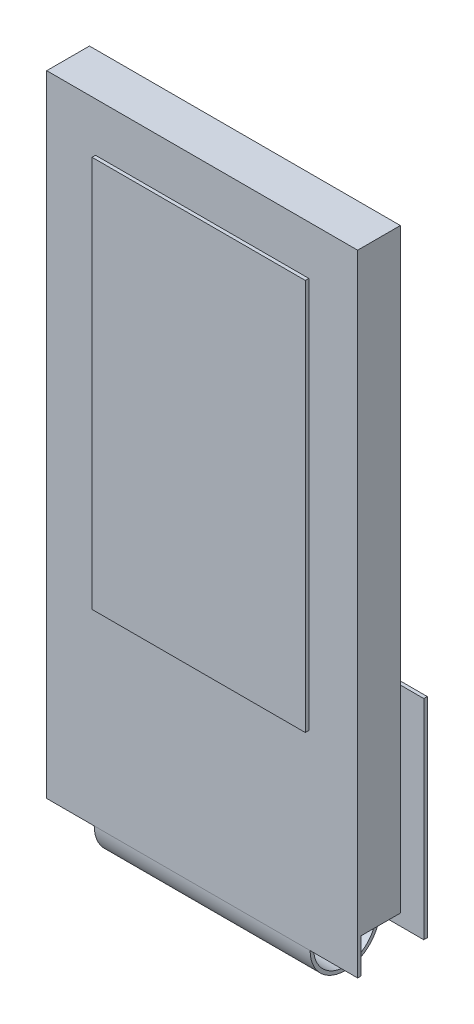
ISO-10303-21;
HEADER;
FILE_DESCRIPTION(('STEP AP214'),'2;1');
FILE_NAME('part.step','',(''),(''),'','','');
FILE_SCHEMA(('AUTOMOTIVE_DESIGN { 1 0 10303 214 1 1 1 1 }'));
ENDSEC;
DATA;
#1=APPLICATION_CONTEXT('core data for automotive mechanical design processes');
#2=APPLICATION_PROTOCOL_DEFINITION('international standard','automotive_design',2000,#1);
#3=PRODUCT_CONTEXT('',#1,'mechanical');
#4=PRODUCT('Part','Part','',(#3));
#5=PRODUCT_RELATED_PRODUCT_CATEGORY('part','',(#4));
#6=PRODUCT_DEFINITION_FORMATION('','',#4);
#7=PRODUCT_DEFINITION_CONTEXT('part definition',#1,'design');
#8=PRODUCT_DEFINITION('design','',#6,#7);
#9=PRODUCT_DEFINITION_SHAPE('','',#8);
#10=(LENGTH_UNIT() NAMED_UNIT(*) SI_UNIT(.MILLI.,.METRE.));
#11=(NAMED_UNIT(*) PLANE_ANGLE_UNIT() SI_UNIT($,.RADIAN.));
#12=(NAMED_UNIT(*) SI_UNIT($,.STERADIAN.) SOLID_ANGLE_UNIT());
#13=UNCERTAINTY_MEASURE_WITH_UNIT(LENGTH_MEASURE(1.E-05),#10,'distance_accuracy_value','');
#14=(GEOMETRIC_REPRESENTATION_CONTEXT(3) GLOBAL_UNCERTAINTY_ASSIGNED_CONTEXT((#13)) GLOBAL_UNIT_ASSIGNED_CONTEXT((#10,
#11,#12)) REPRESENTATION_CONTEXT('',''));
#15=CARTESIAN_POINT('',(0.,0.,0.));
#16=DIRECTION('',(0.,0.,1.));
#17=DIRECTION('',(1.,0.,0.));
#18=AXIS2_PLACEMENT_3D('',#15,#16,#17);
#19=CARTESIAN_POINT('',(4.464,-8.55,1.227));
#20=DIRECTION('',(-1.,0.,0.));
#21=DIRECTION('',(0.,0.,1.));
#22=AXIS2_PLACEMENT_3D('',#19,#20,#21);
#23=PLANE('',#22);
#24=DIRECTION('',(0.,1.,0.));
#25=VECTOR('',#24,1.);
#26=CARTESIAN_POINT('',(4.464,-8.55,1.227));
#27=LINE('',#26,#25);
#28=CARTESIAN_POINT('',(4.464,-9.55,1.227));
#29=VERTEX_POINT('',#28);
#30=CARTESIAN_POINT('',(4.464,8.55,1.227));
#31=VERTEX_POINT('',#30);
#32=EDGE_CURVE('E199',#29,#31,#27,.T.);
#33=ORIENTED_EDGE('',*,*,#32,.F.);
#34=DIRECTION('',(0.,0.,1.));
#35=VECTOR('',#34,1.);
#36=CARTESIAN_POINT('',(4.464,-9.55,-0.774));
#37=LINE('',#36,#35);
#38=CARTESIAN_POINT('',(4.464,-9.55,1.127));
#39=VERTEX_POINT('',#38);
#40=EDGE_CURVE('E416',#39,#29,#37,.T.);
#41=ORIENTED_EDGE('',*,*,#40,.F.);
#42=DIRECTION('',(0.,1.,0.));
#43=VECTOR('',#42,1.);
#44=CARTESIAN_POINT('',(4.464,-9.55,1.127));
#45=LINE('',#44,#43);
#46=CARTESIAN_POINT('',(4.464,-8.55,1.127));
#47=VERTEX_POINT('',#46);
#48=EDGE_CURVE('E250',#39,#47,#45,.T.);
#49=ORIENTED_EDGE('',*,*,#48,.T.);
#50=DIRECTION('',(0.,0.,-1.));
#51=VECTOR('',#50,1.);
#52=CARTESIAN_POINT('',(4.464,-8.55,1.227));
#53=LINE('',#52,#51);
#54=CARTESIAN_POINT('',(4.464,-8.55,0.));
#55=VERTEX_POINT('',#54);
#56=EDGE_CURVE('E63',#47,#55,#53,.T.);
#57=ORIENTED_EDGE('',*,*,#56,.T.);
#58=DIRECTION('',(0.,1.,0.));
#59=VECTOR('',#58,1.);
#60=CARTESIAN_POINT('',(4.464,-8.55,0.));
#61=LINE('',#60,#59);
#62=CARTESIAN_POINT('',(4.464,8.55,0.));
#63=VERTEX_POINT('',#62);
#64=EDGE_CURVE('E203',#55,#63,#61,.T.);
#65=ORIENTED_EDGE('',*,*,#64,.T.);
#66=DIRECTION('',(0.,0.,-1.));
#67=VECTOR('',#66,1.);
#68=CARTESIAN_POINT('',(4.464,8.55,1.227));
#69=LINE('',#68,#67);
#70=EDGE_CURVE('E11',#31,#63,#69,.T.);
#71=ORIENTED_EDGE('',*,*,#70,.F.);
#72=EDGE_LOOP('',(#33,#41,#49,#57,#65,#71));
#73=FACE_BOUND('',#72,.T.);
#74=ADVANCED_FACE('F40',(#73),#23,.F.);
#75=CARTESIAN_POINT('',(-4.464,-8.55,1.227));
#76=DIRECTION('',(1.,0.,0.));
#77=DIRECTION('',(0.,0.,-1.));
#78=AXIS2_PLACEMENT_3D('',#75,#76,#77);
#79=PLANE('',#78);
#80=DIRECTION('',(0.,-1.,0.));
#81=VECTOR('',#80,1.);
#82=CARTESIAN_POINT('',(-4.464,-9.55,1.127));
#83=LINE('',#82,#81);
#84=CARTESIAN_POINT('',(-4.464,-8.55,1.127));
#85=VERTEX_POINT('',#84);
#86=CARTESIAN_POINT('',(-4.464,-9.55,1.127));
#87=VERTEX_POINT('',#86);
#88=EDGE_CURVE('E186',#85,#87,#83,.T.);
#89=ORIENTED_EDGE('',*,*,#88,.T.);
#90=DIRECTION('',(0.,0.,1.));
#91=VECTOR('',#90,1.);
#92=CARTESIAN_POINT('',(-4.464,-9.55,-0.774));
#93=LINE('',#92,#91);
#94=CARTESIAN_POINT('',(-4.464,-9.55,1.227));
#95=VERTEX_POINT('',#94);
#96=EDGE_CURVE('E169',#87,#95,#93,.T.);
#97=ORIENTED_EDGE('',*,*,#96,.T.);
#98=DIRECTION('',(0.,-1.,0.));
#99=VECTOR('',#98,1.);
#100=CARTESIAN_POINT('',(-4.464,-8.55,1.227));
#101=LINE('',#100,#99);
#102=CARTESIAN_POINT('',(-4.464,8.55,1.227));
#103=VERTEX_POINT('',#102);
#104=EDGE_CURVE('E184',#103,#95,#101,.T.);
#105=ORIENTED_EDGE('',*,*,#104,.F.);
#106=DIRECTION('',(0.,0.,-1.));
#107=VECTOR('',#106,1.);
#108=CARTESIAN_POINT('',(-4.464,8.55,1.227));
#109=LINE('',#108,#107);
#110=CARTESIAN_POINT('',(-4.464,8.55,0.));
#111=VERTEX_POINT('',#110);
#112=EDGE_CURVE('E48',#103,#111,#109,.T.);
#113=ORIENTED_EDGE('',*,*,#112,.T.);
#114=DIRECTION('',(0.,-1.,0.));
#115=VECTOR('',#114,1.);
#116=CARTESIAN_POINT('',(-4.464,-8.55,0.));
#117=LINE('',#116,#115);
#118=CARTESIAN_POINT('',(-4.464,-8.55,0.));
#119=VERTEX_POINT('',#118);
#120=EDGE_CURVE('E209',#111,#119,#117,.T.);
#121=ORIENTED_EDGE('',*,*,#120,.T.);
#122=DIRECTION('',(0.,0.,-1.));
#123=VECTOR('',#122,1.);
#124=CARTESIAN_POINT('',(-4.464,-8.55,1.227));
#125=LINE('',#124,#123);
#126=EDGE_CURVE('E197',#85,#119,#125,.T.);
#127=ORIENTED_EDGE('',*,*,#126,.F.);
#128=EDGE_LOOP('',(#89,#97,#105,#113,#121,#127));
#129=FACE_BOUND('',#128,.T.);
#130=ADVANCED_FACE('F182',(#129),#79,.F.);
#131=CARTESIAN_POINT('',(0.,0.,1.227));
#132=DIRECTION('',(0.,0.,-1.));
#133=DIRECTION('',(-1.,0.,0.));
#134=AXIS2_PLACEMENT_3D('',#131,#132,#133);
#135=PLANE('',#134);
#136=ORIENTED_EDGE('',*,*,#32,.T.);
#137=DIRECTION('',(-1.,0.,0.));
#138=VECTOR('',#137,1.);
#139=CARTESIAN_POINT('',(-4.464,8.55,1.227));
#140=LINE('',#139,#138);
#141=EDGE_CURVE('E194',#31,#103,#140,.T.);
#142=ORIENTED_EDGE('',*,*,#141,.T.);
#143=ORIENTED_EDGE('',*,*,#104,.T.);
#144=DIRECTION('',(1.,0.,0.));
#145=VECTOR('',#144,1.);
#146=CARTESIAN_POINT('',(-11.7441098892805,-9.55,1.227));
#147=LINE('',#146,#145);
#148=CARTESIAN_POINT('',(-3.1,-9.55,1.227));
#149=VERTEX_POINT('',#148);
#150=EDGE_CURVE('E166',#95,#149,#147,.T.);
#151=ORIENTED_EDGE('',*,*,#150,.T.);
#152=CARTESIAN_POINT('',(3.1,-9.55,1.227));
#153=VERTEX_POINT('',#152);
#154=EDGE_CURVE('E178',#149,#153,#147,.T.);
#155=ORIENTED_EDGE('',*,*,#154,.T.);
#156=DIRECTION('',(-1.,0.,0.));
#157=VECTOR('',#156,1.);
#158=CARTESIAN_POINT('',(3.1,-9.55,1.227));
#159=LINE('',#158,#157);
#160=EDGE_CURVE('E296',#29,#153,#159,.T.);
#161=ORIENTED_EDGE('',*,*,#160,.F.);
#162=EDGE_LOOP('',(#136,#142,#143,#151,#155,#161));
#163=FACE_BOUND('',#162,.T.);
#164=DIRECTION('',(0.,1.,0.));
#165=VECTOR('',#164,1.);
#166=CARTESIAN_POINT('',(3.062,-4.097,1.227));
#167=LINE('',#166,#165);
#168=CARTESIAN_POINT('',(3.062,-4.097,1.227));
#169=VERTEX_POINT('',#168);
#170=CARTESIAN_POINT('',(3.062,7.147,1.227));
#171=VERTEX_POINT('',#170);
#172=EDGE_CURVE('E230',#169,#171,#167,.T.);
#173=ORIENTED_EDGE('',*,*,#172,.F.);
#174=DIRECTION('',(1.,0.,0.));
#175=VECTOR('',#174,1.);
#176=CARTESIAN_POINT('',(-3.062,-4.097,1.227));
#177=LINE('',#176,#175);
#178=CARTESIAN_POINT('',(-3.062,-4.097,1.227));
#179=VERTEX_POINT('',#178);
#180=EDGE_CURVE('E269',#179,#169,#177,.T.);
#181=ORIENTED_EDGE('',*,*,#180,.F.);
#182=DIRECTION('',(0.,-1.,0.));
#183=VECTOR('',#182,1.);
#184=CARTESIAN_POINT('',(-3.062,-4.097,1.227));
#185=LINE('',#184,#183);
#186=CARTESIAN_POINT('',(-3.062,7.147,1.227));
#187=VERTEX_POINT('',#186);
#188=EDGE_CURVE('E278',#187,#179,#185,.T.);
#189=ORIENTED_EDGE('',*,*,#188,.F.);
#190=DIRECTION('',(-1.,0.,0.));
#191=VECTOR('',#190,1.);
#192=CARTESIAN_POINT('',(-3.062,7.147,1.227));
#193=LINE('',#192,#191);
#194=EDGE_CURVE('E234',#171,#187,#193,.T.);
#195=ORIENTED_EDGE('',*,*,#194,.F.);
#196=EDGE_LOOP('',(#173,#181,#189,#195));
#197=FACE_BOUND('',#196,.T.);
#198=ADVANCED_FACE('F192',(#163,#197),#135,.F.);
#199=DIRECTION('',(0.,-1.,0.));
#200=VECTOR('',#199,1.);
#201=CARTESIAN_POINT('',(4.464,-3.55,-0.673));
#202=LINE('',#201,#200);
#203=CARTESIAN_POINT('',(4.464,-3.55,-0.673));
#204=VERTEX_POINT('',#203);
#205=CARTESIAN_POINT('',(4.464,-9.55,-0.673000000000001));
#206=VERTEX_POINT('',#205);
#207=EDGE_CURVE('E247',#204,#206,#202,.T.);
#208=ORIENTED_EDGE('',*,*,#207,.T.);
#209=CARTESIAN_POINT('',(4.464,-9.55,-0.773));
#210=VERTEX_POINT('',#209);
#211=EDGE_CURVE('E415',#210,#206,#37,.T.);
#212=ORIENTED_EDGE('',*,*,#211,.F.);
#213=DIRECTION('',(0.,1.,0.));
#214=VECTOR('',#213,1.);
#215=CARTESIAN_POINT('',(4.464,-9.55,-0.773));
#216=LINE('',#215,#214);
#217=CARTESIAN_POINT('',(4.464,-3.55,-0.773));
#218=VERTEX_POINT('',#217);
#219=EDGE_CURVE('E240',#210,#218,#216,.T.);
#220=ORIENTED_EDGE('',*,*,#219,.T.);
#221=DIRECTION('',(0.,0.,1.));
#222=VECTOR('',#221,1.);
#223=CARTESIAN_POINT('',(4.464,-3.55,-0.773));
#224=LINE('',#223,#222);
#225=EDGE_CURVE('E243',#218,#204,#224,.T.);
#226=ORIENTED_EDGE('',*,*,#225,.T.);
#227=EDGE_LOOP('',(#208,#212,#220,#226));
#228=FACE_BOUND('',#227,.T.);
#229=ADVANCED_FACE('F42',(#228),#23,.F.);
#230=CARTESIAN_POINT('',(-4.464,8.55,1.227));
#231=DIRECTION('',(0.,-1.,0.));
#232=DIRECTION('',(0.,0.,-1.));
#233=AXIS2_PLACEMENT_3D('',#230,#231,#232);
#234=PLANE('',#233);
#235=DIRECTION('',(-1.,0.,0.));
#236=VECTOR('',#235,1.);
#237=CARTESIAN_POINT('',(-4.464,8.55,0.));
#238=LINE('',#237,#236);
#239=EDGE_CURVE('E206',#63,#111,#238,.T.);
#240=ORIENTED_EDGE('',*,*,#239,.T.);
#241=ORIENTED_EDGE('',*,*,#112,.F.);
#242=ORIENTED_EDGE('',*,*,#141,.F.);
#243=ORIENTED_EDGE('',*,*,#70,.T.);
#244=EDGE_LOOP('',(#240,#241,#242,#243));
#245=FACE_BOUND('',#244,.T.);
#246=ADVANCED_FACE('F299',(#245),#234,.F.);
#247=DIRECTION('',(0.,-1.,0.));
#248=VECTOR('',#247,1.);
#249=CARTESIAN_POINT('',(-4.464,-9.55,-0.773));
#250=LINE('',#249,#248);
#251=CARTESIAN_POINT('',(-4.464,-3.55,-0.773));
#252=VERTEX_POINT('',#251);
#253=CARTESIAN_POINT('',(-4.464,-9.55,-0.773));
#254=VERTEX_POINT('',#253);
#255=EDGE_CURVE('E225',#252,#254,#250,.T.);
#256=ORIENTED_EDGE('',*,*,#255,.T.);
#257=CARTESIAN_POINT('',(-4.464,-9.55,-0.673000000000001));
#258=VERTEX_POINT('',#257);
#259=EDGE_CURVE('E188',#254,#258,#93,.T.);
#260=ORIENTED_EDGE('',*,*,#259,.T.);
#261=DIRECTION('',(0.,1.,0.));
#262=VECTOR('',#261,1.);
#263=CARTESIAN_POINT('',(-4.464,-3.55,-0.673));
#264=LINE('',#263,#262);
#265=CARTESIAN_POINT('',(-4.464,-3.55,-0.673));
#266=VERTEX_POINT('',#265);
#267=EDGE_CURVE('E231',#258,#266,#264,.T.);
#268=ORIENTED_EDGE('',*,*,#267,.T.);
#269=DIRECTION('',(0.,0.,-1.));
#270=VECTOR('',#269,1.);
#271=CARTESIAN_POINT('',(-4.464,-3.55,-0.773));
#272=LINE('',#271,#270);
#273=EDGE_CURVE('E236',#266,#252,#272,.T.);
#274=ORIENTED_EDGE('',*,*,#273,.T.);
#275=EDGE_LOOP('',(#256,#260,#268,#274));
#276=FACE_BOUND('',#275,.T.);
#277=ADVANCED_FACE('F301',(#276),#79,.F.);
#278=CARTESIAN_POINT('',(-4.464,-8.55,1.227));
#279=DIRECTION('',(0.,1.,0.));
#280=DIRECTION('',(0.,0.,1.));
#281=AXIS2_PLACEMENT_3D('',#278,#279,#280);
#282=PLANE('',#281);
#283=ORIENTED_EDGE('',*,*,#56,.F.);
#284=DIRECTION('',(1.,0.,0.));
#285=VECTOR('',#284,1.);
#286=CARTESIAN_POINT('',(-11.7441098892805,-8.55,1.127));
#287=LINE('',#286,#285);
#288=EDGE_CURVE('E221',#85,#47,#287,.T.);
#289=ORIENTED_EDGE('',*,*,#288,.F.);
#290=ORIENTED_EDGE('',*,*,#126,.T.);
#291=DIRECTION('',(1.,0.,0.));
#292=VECTOR('',#291,1.);
#293=CARTESIAN_POINT('',(-4.464,-8.55,0.));
#294=LINE('',#293,#292);
#295=EDGE_CURVE('E212',#119,#55,#294,.T.);
#296=ORIENTED_EDGE('',*,*,#295,.T.);
#297=EDGE_LOOP('',(#283,#289,#290,#296));
#298=FACE_BOUND('',#297,.T.);
#299=ADVANCED_FACE('F220',(#298),#282,.F.);
#300=CARTESIAN_POINT('',(0.,0.,0.));
#301=DIRECTION('',(0.,0.,-1.));
#302=DIRECTION('',(-1.,0.,0.));
#303=AXIS2_PLACEMENT_3D('',#300,#301,#302);
#304=PLANE('',#303);
#305=ORIENTED_EDGE('',*,*,#64,.F.);
#306=ORIENTED_EDGE('',*,*,#295,.F.);
#307=ORIENTED_EDGE('',*,*,#120,.F.);
#308=ORIENTED_EDGE('',*,*,#239,.F.);
#309=EDGE_LOOP('',(#305,#306,#307,#308));
#310=FACE_BOUND('',#309,.T.);
#311=ADVANCED_FACE('F219',(#310),#304,.T.);
#312=CARTESIAN_POINT('',(3.062,-4.097,1.327));
#313=DIRECTION('',(-1.,0.,0.));
#314=DIRECTION('',(0.,0.,1.));
#315=AXIS2_PLACEMENT_3D('',#312,#313,#314);
#316=PLANE('',#315);
#317=ORIENTED_EDGE('',*,*,#172,.T.);
#318=DIRECTION('',(0.,0.,-1.));
#319=VECTOR('',#318,1.);
#320=CARTESIAN_POINT('',(3.062,7.147,1.327));
#321=LINE('',#320,#319);
#322=CARTESIAN_POINT('',(3.062,7.147,1.327));
#323=VERTEX_POINT('',#322);
#324=EDGE_CURVE('E207',#323,#171,#321,.T.);
#325=ORIENTED_EDGE('',*,*,#324,.F.);
#326=DIRECTION('',(0.,1.,0.));
#327=VECTOR('',#326,1.);
#328=CARTESIAN_POINT('',(3.062,-4.097,1.327));
#329=LINE('',#328,#327);
#330=CARTESIAN_POINT('',(3.062,-4.097,1.327));
#331=VERTEX_POINT('',#330);
#332=EDGE_CURVE('E265',#331,#323,#329,.T.);
#333=ORIENTED_EDGE('',*,*,#332,.F.);
#334=DIRECTION('',(0.,0.,-1.));
#335=VECTOR('',#334,1.);
#336=CARTESIAN_POINT('',(3.062,-4.097,1.327));
#337=LINE('',#336,#335);
#338=EDGE_CURVE('E274',#331,#169,#337,.T.);
#339=ORIENTED_EDGE('',*,*,#338,.T.);
#340=EDGE_LOOP('',(#317,#325,#333,#339));
#341=FACE_BOUND('',#340,.T.);
#342=ADVANCED_FACE('F322',(#341),#316,.F.);
#343=CARTESIAN_POINT('',(-3.062,7.147,1.327));
#344=DIRECTION('',(0.,-1.,0.));
#345=DIRECTION('',(0.,0.,-1.));
#346=AXIS2_PLACEMENT_3D('',#343,#344,#345);
#347=PLANE('',#346);
#348=ORIENTED_EDGE('',*,*,#194,.T.);
#349=DIRECTION('',(0.,0.,-1.));
#350=VECTOR('',#349,1.);
#351=CARTESIAN_POINT('',(-3.062,7.147,1.327));
#352=LINE('',#351,#350);
#353=CARTESIAN_POINT('',(-3.062,7.147,1.327));
#354=VERTEX_POINT('',#353);
#355=EDGE_CURVE('E288',#354,#187,#352,.T.);
#356=ORIENTED_EDGE('',*,*,#355,.F.);
#357=DIRECTION('',(-1.,0.,0.));
#358=VECTOR('',#357,1.);
#359=CARTESIAN_POINT('',(-3.062,7.147,1.327));
#360=LINE('',#359,#358);
#361=EDGE_CURVE('E268',#323,#354,#360,.T.);
#362=ORIENTED_EDGE('',*,*,#361,.F.);
#363=ORIENTED_EDGE('',*,*,#324,.T.);
#364=EDGE_LOOP('',(#348,#356,#362,#363));
#365=FACE_BOUND('',#364,.T.);
#366=ADVANCED_FACE('F326',(#365),#347,.F.);
#367=CARTESIAN_POINT('',(-3.062,-4.097,1.327));
#368=DIRECTION('',(1.,0.,0.));
#369=DIRECTION('',(0.,0.,-1.));
#370=AXIS2_PLACEMENT_3D('',#367,#368,#369);
#371=PLANE('',#370);
#372=ORIENTED_EDGE('',*,*,#188,.T.);
#373=DIRECTION('',(0.,0.,-1.));
#374=VECTOR('',#373,1.);
#375=CARTESIAN_POINT('',(-3.062,-4.097,1.327));
#376=LINE('',#375,#374);
#377=CARTESIAN_POINT('',(-3.062,-4.097,1.327));
#378=VERTEX_POINT('',#377);
#379=EDGE_CURVE('E285',#378,#179,#376,.T.);
#380=ORIENTED_EDGE('',*,*,#379,.F.);
#381=DIRECTION('',(0.,-1.,0.));
#382=VECTOR('',#381,1.);
#383=CARTESIAN_POINT('',(-3.062,-4.097,1.327));
#384=LINE('',#383,#382);
#385=EDGE_CURVE('E271',#354,#378,#384,.T.);
#386=ORIENTED_EDGE('',*,*,#385,.F.);
#387=ORIENTED_EDGE('',*,*,#355,.T.);
#388=EDGE_LOOP('',(#372,#380,#386,#387));
#389=FACE_BOUND('',#388,.T.);
#390=ADVANCED_FACE('F330',(#389),#371,.F.);
#391=CARTESIAN_POINT('',(-3.062,-4.097,1.327));
#392=DIRECTION('',(0.,1.,0.));
#393=DIRECTION('',(0.,0.,1.));
#394=AXIS2_PLACEMENT_3D('',#391,#392,#393);
#395=PLANE('',#394);
#396=ORIENTED_EDGE('',*,*,#180,.T.);
#397=ORIENTED_EDGE('',*,*,#338,.F.);
#398=DIRECTION('',(1.,0.,0.));
#399=VECTOR('',#398,1.);
#400=CARTESIAN_POINT('',(-3.062,-4.097,1.327));
#401=LINE('',#400,#399);
#402=EDGE_CURVE('E273',#378,#331,#401,.T.);
#403=ORIENTED_EDGE('',*,*,#402,.F.);
#404=ORIENTED_EDGE('',*,*,#379,.T.);
#405=EDGE_LOOP('',(#396,#397,#403,#404));
#406=FACE_BOUND('',#405,.T.);
#407=ADVANCED_FACE('F334',(#406),#395,.F.);
#408=CARTESIAN_POINT('',(0.,0.,1.327));
#409=DIRECTION('',(0.,0.,-1.));
#410=DIRECTION('',(-1.,0.,0.));
#411=AXIS2_PLACEMENT_3D('',#408,#409,#410);
#412=PLANE('',#411);
#413=ORIENTED_EDGE('',*,*,#332,.T.);
#414=ORIENTED_EDGE('',*,*,#361,.T.);
#415=ORIENTED_EDGE('',*,*,#385,.T.);
#416=ORIENTED_EDGE('',*,*,#402,.T.);
#417=EDGE_LOOP('',(#413,#414,#415,#416));
#418=FACE_BOUND('',#417,.T.);
#419=ADVANCED_FACE('F338',(#418),#412,.F.);
#420=CARTESIAN_POINT('',(-11.7441098892805,-9.55,1.127));
#421=DIRECTION('',(0.,0.,-1.));
#422=DIRECTION('',(0.,1.,0.));
#423=AXIS2_PLACEMENT_3D('',#420,#421,#422);
#424=PLANE('',#423);
#425=ORIENTED_EDGE('',*,*,#88,.F.);
#426=ORIENTED_EDGE('',*,*,#288,.T.);
#427=ORIENTED_EDGE('',*,*,#48,.F.);
#428=DIRECTION('',(1.,0.,0.));
#429=VECTOR('',#428,1.);
#430=CARTESIAN_POINT('',(-11.7441098892805,-9.55,1.127));
#431=LINE('',#430,#429);
#432=CARTESIAN_POINT('',(3.1,-9.55,1.127));
#433=VERTEX_POINT('',#432);
#434=EDGE_CURVE('E403',#433,#39,#431,.T.);
#435=ORIENTED_EDGE('',*,*,#434,.F.);
#436=DIRECTION('',(1.,0.,0.));
#437=VECTOR('',#436,1.);
#438=CARTESIAN_POINT('',(-11.7441098892805,-9.55,1.127));
#439=LINE('',#438,#437);
#440=CARTESIAN_POINT('',(-3.1,-9.55,1.127));
#441=VERTEX_POINT('',#440);
#442=EDGE_CURVE('E253',#441,#433,#439,.T.);
#443=ORIENTED_EDGE('',*,*,#442,.F.);
#444=EDGE_CURVE('E226',#87,#441,#439,.T.);
#445=ORIENTED_EDGE('',*,*,#444,.F.);
#446=EDGE_LOOP('',(#425,#426,#427,#435,#443,#445));
#447=FACE_BOUND('',#446,.T.);
#448=ADVANCED_FACE('F228',(#447),#424,.T.);
#449=CARTESIAN_POINT('',(-11.7441098892805,-9.55,0.226999999999999));
#450=DIRECTION('',(1.,0.,0.));
#451=DIRECTION('',(0.,0.,-1.));
#452=AXIS2_PLACEMENT_3D('',#449,#450,#451);
#453=CYLINDRICAL_SURFACE('',#452,0.900000000000001);
#454=CARTESIAN_POINT('',(-3.1,-9.55,0.226999999999999));
#455=DIRECTION('',(1.,0.,0.));
#456=DIRECTION('',(0.,0.,-1.));
#457=AXIS2_PLACEMENT_3D('',#454,#455,#456);
#458=CIRCLE('',#457,0.900000000000001);
#459=CARTESIAN_POINT('',(-3.1,-9.55,-0.673000000000001));
#460=VERTEX_POINT('',#459);
#461=EDGE_CURVE('E189',#460,#441,#458,.F.);
#462=ORIENTED_EDGE('',*,*,#461,.T.);
#463=ORIENTED_EDGE('',*,*,#442,.T.);
#464=CARTESIAN_POINT('',(3.1,-9.55,0.226999999999999));
#465=DIRECTION('',(-1.,0.,0.));
#466=DIRECTION('',(0.,0.,1.));
#467=AXIS2_PLACEMENT_3D('',#464,#465,#466);
#468=CIRCLE('',#467,0.900000000000001);
#469=CARTESIAN_POINT('',(3.1,-9.55,-0.673000000000001));
#470=VERTEX_POINT('',#469);
#471=EDGE_CURVE('E417',#433,#470,#468,.F.);
#472=ORIENTED_EDGE('',*,*,#471,.T.);
#473=DIRECTION('',(1.,0.,0.));
#474=VECTOR('',#473,1.);
#475=CARTESIAN_POINT('',(-11.7441098892805,-9.55,-0.673000000000001));
#476=LINE('',#475,#474);
#477=EDGE_CURVE('E257',#460,#470,#476,.T.);
#478=ORIENTED_EDGE('',*,*,#477,.F.);
#479=EDGE_LOOP('',(#462,#463,#472,#478));
#480=FACE_BOUND('',#479,.T.);
#481=ADVANCED_FACE('F358',(#480),#453,.F.);
#482=CARTESIAN_POINT('',(-11.7441098892805,-3.55,-0.673));
#483=DIRECTION('',(0.,0.,1.));
#484=DIRECTION('',(0.,-1.,0.));
#485=AXIS2_PLACEMENT_3D('',#482,#483,#484);
#486=PLANE('',#485);
#487=ORIENTED_EDGE('',*,*,#267,.F.);
#488=EDGE_CURVE('E254',#258,#460,#476,.T.);
#489=ORIENTED_EDGE('',*,*,#488,.T.);
#490=ORIENTED_EDGE('',*,*,#477,.T.);
#491=DIRECTION('',(1.,0.,0.));
#492=VECTOR('',#491,1.);
#493=CARTESIAN_POINT('',(-11.7441098892805,-9.55,-0.673000000000001));
#494=LINE('',#493,#492);
#495=EDGE_CURVE('E400',#470,#206,#494,.T.);
#496=ORIENTED_EDGE('',*,*,#495,.T.);
#497=ORIENTED_EDGE('',*,*,#207,.F.);
#498=DIRECTION('',(1.,0.,0.));
#499=VECTOR('',#498,1.);
#500=CARTESIAN_POINT('',(-11.7441098892805,-3.55,-0.673));
#501=LINE('',#500,#499);
#502=EDGE_CURVE('E258',#266,#204,#501,.T.);
#503=ORIENTED_EDGE('',*,*,#502,.F.);
#504=EDGE_LOOP('',(#487,#489,#490,#496,#497,#503));
#505=FACE_BOUND('',#504,.T.);
#506=ADVANCED_FACE('F354',(#505),#486,.T.);
#507=CARTESIAN_POINT('',(-11.7441098892805,-3.55,-0.773));
#508=DIRECTION('',(0.,1.,0.));
#509=DIRECTION('',(0.,0.,1.));
#510=AXIS2_PLACEMENT_3D('',#507,#508,#509);
#511=PLANE('',#510);
#512=ORIENTED_EDGE('',*,*,#273,.F.);
#513=ORIENTED_EDGE('',*,*,#502,.T.);
#514=ORIENTED_EDGE('',*,*,#225,.F.);
#515=DIRECTION('',(1.,0.,0.));
#516=VECTOR('',#515,1.);
#517=CARTESIAN_POINT('',(-11.7441098892805,-3.55,-0.773));
#518=LINE('',#517,#516);
#519=EDGE_CURVE('E260',#252,#218,#518,.T.);
#520=ORIENTED_EDGE('',*,*,#519,.F.);
#521=EDGE_LOOP('',(#512,#513,#514,#520));
#522=FACE_BOUND('',#521,.T.);
#523=ADVANCED_FACE('F351',(#522),#511,.T.);
#524=CARTESIAN_POINT('',(-11.7441098892805,-9.55,-0.773));
#525=DIRECTION('',(0.,0.,-1.));
#526=DIRECTION('',(0.,1.,0.));
#527=AXIS2_PLACEMENT_3D('',#524,#525,#526);
#528=PLANE('',#527);
#529=ORIENTED_EDGE('',*,*,#255,.F.);
#530=ORIENTED_EDGE('',*,*,#519,.T.);
#531=ORIENTED_EDGE('',*,*,#219,.F.);
#532=DIRECTION('',(1.,0.,0.));
#533=VECTOR('',#532,1.);
#534=CARTESIAN_POINT('',(-11.7441098892805,-9.55,-0.773));
#535=LINE('',#534,#533);
#536=CARTESIAN_POINT('',(3.1,-9.55,-0.773));
#537=VERTEX_POINT('',#536);
#538=EDGE_CURVE('E395',#537,#210,#535,.T.);
#539=ORIENTED_EDGE('',*,*,#538,.F.);
#540=DIRECTION('',(1.,0.,0.));
#541=VECTOR('',#540,1.);
#542=CARTESIAN_POINT('',(-11.7441098892805,-9.55,-0.773));
#543=LINE('',#542,#541);
#544=CARTESIAN_POINT('',(-3.1,-9.55,-0.773));
#545=VERTEX_POINT('',#544);
#546=EDGE_CURVE('E177',#545,#537,#543,.T.);
#547=ORIENTED_EDGE('',*,*,#546,.F.);
#548=EDGE_CURVE('E262',#254,#545,#543,.T.);
#549=ORIENTED_EDGE('',*,*,#548,.F.);
#550=EDGE_LOOP('',(#529,#530,#531,#539,#547,#549));
#551=FACE_BOUND('',#550,.T.);
#552=ADVANCED_FACE('F347',(#551),#528,.T.);
#553=CARTESIAN_POINT('',(-11.7441098892805,-9.55,0.227));
#554=DIRECTION('',(1.,0.,0.));
#555=DIRECTION('',(0.,0.,-1.));
#556=AXIS2_PLACEMENT_3D('',#553,#554,#555);
#557=CYLINDRICAL_SURFACE('',#556,1.);
#558=CARTESIAN_POINT('',(-3.1,-9.55,0.227));
#559=DIRECTION('',(1.,0.,0.));
#560=DIRECTION('',(0.,0.,-1.));
#561=AXIS2_PLACEMENT_3D('',#558,#559,#560);
#562=CIRCLE('',#561,1.);
#563=EDGE_CURVE('E384',#149,#545,#562,.T.);
#564=ORIENTED_EDGE('',*,*,#563,.T.);
#565=ORIENTED_EDGE('',*,*,#546,.T.);
#566=CARTESIAN_POINT('',(3.1,-9.55,0.227));
#567=DIRECTION('',(-1.,0.,0.));
#568=DIRECTION('',(0.,0.,1.));
#569=AXIS2_PLACEMENT_3D('',#566,#567,#568);
#570=CIRCLE('',#569,1.);
#571=EDGE_CURVE('E55',#537,#153,#570,.T.);
#572=ORIENTED_EDGE('',*,*,#571,.T.);
#573=ORIENTED_EDGE('',*,*,#154,.F.);
#574=EDGE_LOOP('',(#564,#565,#572,#573));
#575=FACE_BOUND('',#574,.T.);
#576=ADVANCED_FACE('F343',(#575),#557,.T.);
#577=CARTESIAN_POINT('',(3.1,-9.55,-0.774));
#578=DIRECTION('',(0.,1.,0.));
#579=DIRECTION('',(0.,0.,1.));
#580=AXIS2_PLACEMENT_3D('',#577,#578,#579);
#581=PLANE('',#580);
#582=ORIENTED_EDGE('',*,*,#40,.T.);
#583=ORIENTED_EDGE('',*,*,#160,.T.);
#584=DIRECTION('',(0.,0.,1.));
#585=VECTOR('',#584,1.);
#586=CARTESIAN_POINT('',(3.1,-9.55,-0.774));
#587=LINE('',#586,#585);
#588=EDGE_CURVE('E423',#433,#153,#587,.T.);
#589=ORIENTED_EDGE('',*,*,#588,.F.);
#590=ORIENTED_EDGE('',*,*,#434,.T.);
#591=EDGE_LOOP('',(#582,#583,#589,#590));
#592=FACE_BOUND('',#591,.T.);
#593=ADVANCED_FACE('F346',(#592),#581,.F.);
#594=CARTESIAN_POINT('',(3.1,-9.55,-0.774));
#595=DIRECTION('',(-1.,0.,0.));
#596=DIRECTION('',(0.,0.,1.));
#597=AXIS2_PLACEMENT_3D('',#594,#595,#596);
#598=PLANE('',#597);
#599=ORIENTED_EDGE('',*,*,#588,.T.);
#600=ORIENTED_EDGE('',*,*,#571,.F.);
#601=EDGE_CURVE('E419',#537,#470,#587,.T.);
#602=ORIENTED_EDGE('',*,*,#601,.T.);
#603=ORIENTED_EDGE('',*,*,#471,.F.);
#604=EDGE_LOOP('',(#599,#600,#602,#603));
#605=FACE_BOUND('',#604,.T.);
#606=ADVANCED_FACE('F365',(#605),#598,.F.);
#607=ORIENTED_EDGE('',*,*,#601,.F.);
#608=ORIENTED_EDGE('',*,*,#538,.T.);
#609=ORIENTED_EDGE('',*,*,#211,.T.);
#610=ORIENTED_EDGE('',*,*,#495,.F.);
#611=EDGE_LOOP('',(#607,#608,#609,#610));
#612=FACE_BOUND('',#611,.T.);
#613=ADVANCED_FACE('F368',(#612),#581,.F.);
#614=CARTESIAN_POINT('',(-4.464,-9.55,-0.774));
#615=DIRECTION('',(0.,1.,0.));
#616=DIRECTION('',(0.,0.,1.));
#617=AXIS2_PLACEMENT_3D('',#614,#615,#616);
#618=PLANE('',#617);
#619=DIRECTION('',(0.,0.,1.));
#620=VECTOR('',#619,1.);
#621=CARTESIAN_POINT('',(-3.1,-9.55,-0.774));
#622=LINE('',#621,#620);
#623=EDGE_CURVE('E172',#441,#149,#622,.T.);
#624=ORIENTED_EDGE('',*,*,#623,.T.);
#625=ORIENTED_EDGE('',*,*,#150,.F.);
#626=ORIENTED_EDGE('',*,*,#96,.F.);
#627=ORIENTED_EDGE('',*,*,#444,.T.);
#628=EDGE_LOOP('',(#624,#625,#626,#627));
#629=FACE_BOUND('',#628,.T.);
#630=ADVANCED_FACE('F168',(#629),#618,.F.);
#631=CARTESIAN_POINT('',(-3.1,-10.55,-0.774));
#632=DIRECTION('',(1.,0.,0.));
#633=DIRECTION('',(0.,0.,-1.));
#634=AXIS2_PLACEMENT_3D('',#631,#632,#633);
#635=PLANE('',#634);
#636=EDGE_CURVE('E244',#545,#460,#622,.T.);
#637=ORIENTED_EDGE('',*,*,#636,.F.);
#638=ORIENTED_EDGE('',*,*,#563,.F.);
#639=ORIENTED_EDGE('',*,*,#623,.F.);
#640=ORIENTED_EDGE('',*,*,#461,.F.);
#641=EDGE_LOOP('',(#637,#638,#639,#640));
#642=FACE_BOUND('',#641,.T.);
#643=ADVANCED_FACE('F375',(#642),#635,.F.);
#644=ORIENTED_EDGE('',*,*,#259,.F.);
#645=ORIENTED_EDGE('',*,*,#548,.T.);
#646=ORIENTED_EDGE('',*,*,#636,.T.);
#647=ORIENTED_EDGE('',*,*,#488,.F.);
#648=EDGE_LOOP('',(#644,#645,#646,#647));
#649=FACE_BOUND('',#648,.T.);
#650=ADVANCED_FACE('F372',(#649),#618,.F.);
#651=CLOSED_SHELL('',(#74,#130,#198,#229,#246,#277,#299,#311,#342,#366,#390,#407,#419,#448,#481,
#506,#523,#552,#576,#593,#606,#613,#630,#643,#650));
#652=MANIFOLD_SOLID_BREP('B2',#651);
#653=ADVANCED_BREP_SHAPE_REPRESENTATION('',(#18,#652),#14);
#654=SHAPE_DEFINITION_REPRESENTATION(#9,#653);
ENDSEC;
END-ISO-10303-21;
